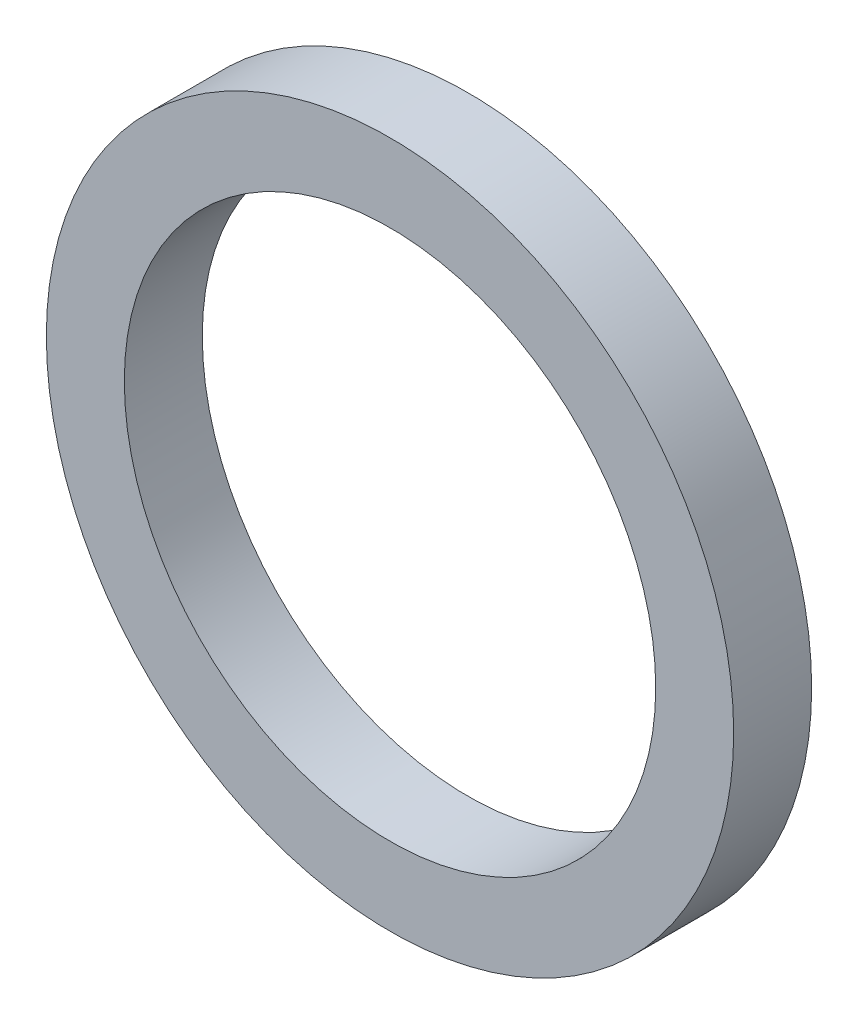
ISO-10303-21;
HEADER;
FILE_DESCRIPTION(('STEP AP214'),'2;1');
FILE_NAME('part.step','',(''),(''),'','','');
FILE_SCHEMA(('AUTOMOTIVE_DESIGN { 1 0 10303 214 1 1 1 1 }'));
ENDSEC;
DATA;
#1=APPLICATION_CONTEXT('core data for automotive mechanical design processes');
#2=APPLICATION_PROTOCOL_DEFINITION('international standard','automotive_design',2000,#1);
#3=PRODUCT_CONTEXT('',#1,'mechanical');
#4=PRODUCT('Part','Part','',(#3));
#5=PRODUCT_RELATED_PRODUCT_CATEGORY('part','',(#4));
#6=PRODUCT_DEFINITION_FORMATION('','',#4);
#7=PRODUCT_DEFINITION_CONTEXT('part definition',#1,'design');
#8=PRODUCT_DEFINITION('design','',#6,#7);
#9=PRODUCT_DEFINITION_SHAPE('','',#8);
#10=(LENGTH_UNIT() NAMED_UNIT(*) SI_UNIT(.MILLI.,.METRE.));
#11=(NAMED_UNIT(*) PLANE_ANGLE_UNIT() SI_UNIT($,.RADIAN.));
#12=(NAMED_UNIT(*) SI_UNIT($,.STERADIAN.) SOLID_ANGLE_UNIT());
#13=UNCERTAINTY_MEASURE_WITH_UNIT(LENGTH_MEASURE(1.E-05),#10,'distance_accuracy_value','');
#14=(GEOMETRIC_REPRESENTATION_CONTEXT(3) GLOBAL_UNCERTAINTY_ASSIGNED_CONTEXT((#13)) GLOBAL_UNIT_ASSIGNED_CONTEXT((#10,
#11,#12)) REPRESENTATION_CONTEXT('',''));
#15=CARTESIAN_POINT('',(0.,0.,0.));
#16=DIRECTION('',(0.,0.,1.));
#17=DIRECTION('',(1.,0.,0.));
#18=AXIS2_PLACEMENT_3D('',#15,#16,#17);
#19=CARTESIAN_POINT('',(5.4102,0.,0.9525));
#20=DIRECTION('',(0.,0.,1.));
#21=DIRECTION('',(1.,0.,0.));
#22=AXIS2_PLACEMENT_3D('',#19,#20,#21);
#23=PLANE('',#22);
#24=CARTESIAN_POINT('',(0.,0.,0.9525));
#25=DIRECTION('',(0.,0.,1.));
#26=DIRECTION('',(1.,0.,0.));
#27=AXIS2_PLACEMENT_3D('',#24,#25,#26);
#28=CIRCLE('',#27,6.9977);
#29=CARTESIAN_POINT('',(6.9977,0.,0.9525));
#30=VERTEX_POINT('',#29);
#31=EDGE_CURVE('E10',#30,#30,#28,.T.);
#32=ORIENTED_EDGE('',*,*,#31,.T.);
#33=EDGE_LOOP('',(#32));
#34=FACE_BOUND('',#33,.T.);
#35=CARTESIAN_POINT('',(0.,0.,0.9525));
#36=DIRECTION('',(0.,0.,1.));
#37=DIRECTION('',(1.,0.,0.));
#38=AXIS2_PLACEMENT_3D('',#35,#36,#37);
#39=CIRCLE('',#38,5.4102);
#40=CARTESIAN_POINT('',(5.4102,0.,0.9525));
#41=VERTEX_POINT('',#40);
#42=EDGE_CURVE('E43',#41,#41,#39,.T.);
#43=ORIENTED_EDGE('',*,*,#42,.F.);
#44=EDGE_LOOP('',(#43));
#45=FACE_BOUND('',#44,.T.);
#46=ADVANCED_FACE('F29',(#34,#45),#23,.T.);
#47=CARTESIAN_POINT('',(0.,0.,0.635));
#48=DIRECTION('',(0.,0.,1.));
#49=DIRECTION('',(1.,0.,0.));
#50=AXIS2_PLACEMENT_3D('',#47,#48,#49);
#51=CYLINDRICAL_SURFACE('',#50,6.9977);
#52=CARTESIAN_POINT('',(0.,0.,-0.635));
#53=DIRECTION('',(0.,0.,1.));
#54=DIRECTION('',(1.,0.,0.));
#55=AXIS2_PLACEMENT_3D('',#52,#53,#54);
#56=CIRCLE('',#55,6.9977);
#57=CARTESIAN_POINT('',(6.9977,0.,-0.635));
#58=VERTEX_POINT('',#57);
#59=EDGE_CURVE('E35',#58,#58,#56,.T.);
#60=ORIENTED_EDGE('',*,*,#59,.T.);
#61=EDGE_LOOP('',(#60));
#62=FACE_BOUND('',#61,.T.);
#63=ORIENTED_EDGE('',*,*,#31,.F.);
#64=EDGE_LOOP('',(#63));
#65=FACE_BOUND('',#64,.T.);
#66=ADVANCED_FACE('F53',(#62,#65),#51,.T.);
#67=CARTESIAN_POINT('',(5.4102,0.,-0.635));
#68=DIRECTION('',(0.,0.,-1.));
#69=DIRECTION('',(-1.,0.,0.));
#70=AXIS2_PLACEMENT_3D('',#67,#68,#69);
#71=PLANE('',#70);
#72=CARTESIAN_POINT('',(0.,0.,-0.635));
#73=DIRECTION('',(0.,0.,1.));
#74=DIRECTION('',(1.,0.,0.));
#75=AXIS2_PLACEMENT_3D('',#72,#73,#74);
#76=CIRCLE('',#75,5.4102);
#77=CARTESIAN_POINT('',(5.4102,0.,-0.635));
#78=VERTEX_POINT('',#77);
#79=EDGE_CURVE('E39',#78,#78,#76,.T.);
#80=ORIENTED_EDGE('',*,*,#79,.T.);
#81=EDGE_LOOP('',(#80));
#82=FACE_BOUND('',#81,.T.);
#83=ORIENTED_EDGE('',*,*,#59,.F.);
#84=EDGE_LOOP('',(#83));
#85=FACE_BOUND('',#84,.T.);
#86=ADVANCED_FACE('F57',(#82,#85),#71,.T.);
#87=CARTESIAN_POINT('',(0.,0.,0.635));
#88=DIRECTION('',(0.,0.,1.));
#89=DIRECTION('',(1.,0.,0.));
#90=AXIS2_PLACEMENT_3D('',#87,#88,#89);
#91=CYLINDRICAL_SURFACE('',#90,5.4102);
#92=ORIENTED_EDGE('',*,*,#42,.T.);
#93=EDGE_LOOP('',(#92));
#94=FACE_BOUND('',#93,.T.);
#95=ORIENTED_EDGE('',*,*,#79,.F.);
#96=EDGE_LOOP('',(#95));
#97=FACE_BOUND('',#96,.T.);
#98=ADVANCED_FACE('F49',(#94,#97),#91,.F.);
#99=CLOSED_SHELL('',(#46,#66,#86,#98));
#100=MANIFOLD_SOLID_BREP('B2',#99);
#101=ADVANCED_BREP_SHAPE_REPRESENTATION('',(#18,#100),#14);
#102=SHAPE_DEFINITION_REPRESENTATION(#9,#101);
ENDSEC;
END-ISO-10303-21;
